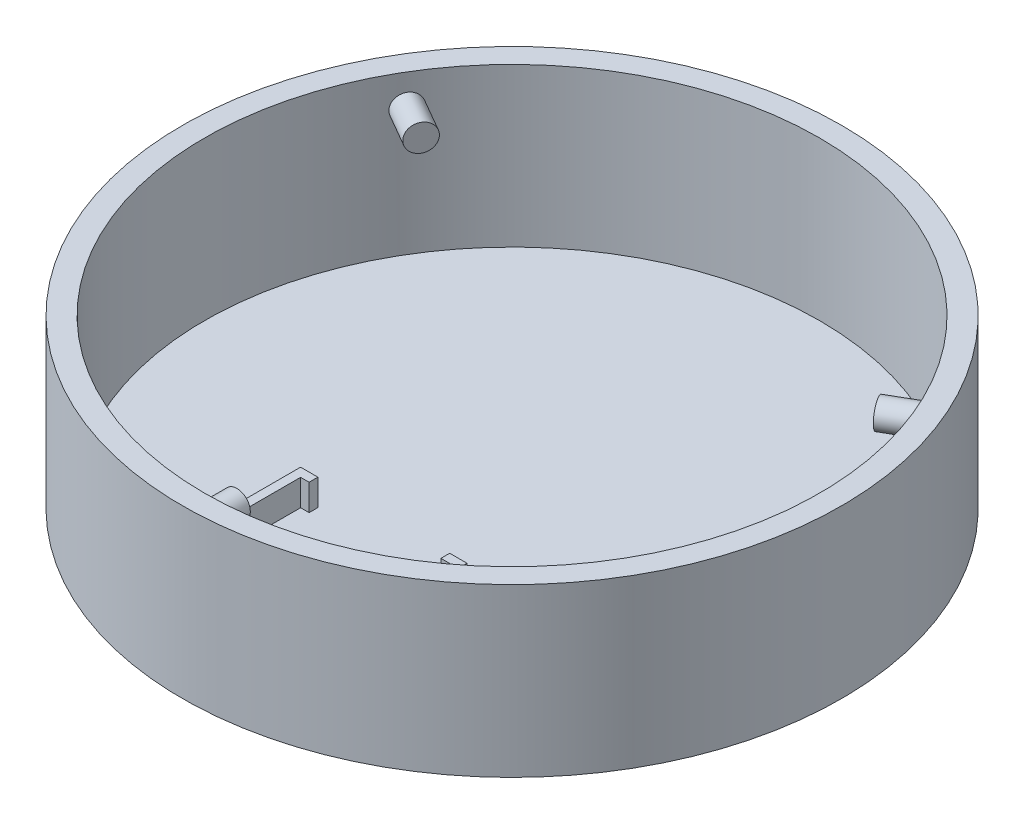
ISO-10303-21;
HEADER;
FILE_DESCRIPTION(('STEP AP214'),'2;1');
FILE_NAME('part.step','',(''),(''),'','','');
FILE_SCHEMA(('AUTOMOTIVE_DESIGN { 1 0 10303 214 1 1 1 1 }'));
ENDSEC;
DATA;
#1=APPLICATION_CONTEXT('core data for automotive mechanical design processes');
#2=APPLICATION_PROTOCOL_DEFINITION('international standard','automotive_design',2000,#1);
#3=PRODUCT_CONTEXT('',#1,'mechanical');
#4=PRODUCT('Part','Part','',(#3));
#5=PRODUCT_RELATED_PRODUCT_CATEGORY('part','',(#4));
#6=PRODUCT_DEFINITION_FORMATION('','',#4);
#7=PRODUCT_DEFINITION_CONTEXT('part definition',#1,'design');
#8=PRODUCT_DEFINITION('design','',#6,#7);
#9=PRODUCT_DEFINITION_SHAPE('','',#8);
#10=(LENGTH_UNIT() NAMED_UNIT(*) SI_UNIT(.MILLI.,.METRE.));
#11=(NAMED_UNIT(*) PLANE_ANGLE_UNIT() SI_UNIT($,.RADIAN.));
#12=(NAMED_UNIT(*) SI_UNIT($,.STERADIAN.) SOLID_ANGLE_UNIT());
#13=UNCERTAINTY_MEASURE_WITH_UNIT(LENGTH_MEASURE(1.E-05),#10,'distance_accuracy_value','');
#14=(GEOMETRIC_REPRESENTATION_CONTEXT(3) GLOBAL_UNCERTAINTY_ASSIGNED_CONTEXT((#13)) GLOBAL_UNIT_ASSIGNED_CONTEXT((#10,
#11,#12)) REPRESENTATION_CONTEXT('',''));
#15=CARTESIAN_POINT('',(0.,0.,0.));
#16=DIRECTION('',(0.,0.,1.));
#17=DIRECTION('',(1.,0.,0.));
#18=AXIS2_PLACEMENT_3D('',#15,#16,#17);
#19=CARTESIAN_POINT('',(17.3810889466934,10.16,30.4071253878576));
#20=DIRECTION('',(0.,0.,1.));
#21=DIRECTION('',(1.,0.,0.));
#22=AXIS2_PLACEMENT_3D('',#19,#20,#21);
#23=PLANE('',#22);
#24=DIRECTION('',(-1.,0.,0.));
#25=VECTOR('',#24,1.);
#26=CARTESIAN_POINT('',(17.3810889466934,10.16,30.4071253878576));
#27=LINE('',#26,#25);
#28=CARTESIAN_POINT('',(-25.7149110533066,10.16,30.4071253878576));
#29=VERTEX_POINT('',#28);
#30=CARTESIAN_POINT('',(-30.7149110533066,10.16,30.4071253878576));
#31=VERTEX_POINT('',#30);
#32=EDGE_CURVE('E197',#29,#31,#27,.T.);
#33=ORIENTED_EDGE('',*,*,#32,.F.);
#34=DIRECTION('',(0.,1.,0.));
#35=VECTOR('',#34,1.);
#36=CARTESIAN_POINT('',(-25.7149110533066,10.16,30.4071253878576));
#37=LINE('',#36,#35);
#38=CARTESIAN_POINT('',(-25.7149110533066,2.54,30.4071253878576));
#39=VERTEX_POINT('',#38);
#40=EDGE_CURVE('E189',#39,#29,#37,.T.);
#41=ORIENTED_EDGE('',*,*,#40,.F.);
#42=DIRECTION('',(-1.,0.,0.));
#43=VECTOR('',#42,1.);
#44=CARTESIAN_POINT('',(17.3810889466934,2.54,30.4071253878576));
#45=LINE('',#44,#43);
#46=CARTESIAN_POINT('',(-30.7149110533066,2.54,30.4071253878576));
#47=VERTEX_POINT('',#46);
#48=EDGE_CURVE('E216',#39,#47,#45,.T.);
#49=ORIENTED_EDGE('',*,*,#48,.T.);
#50=DIRECTION('',(0.,-1.,0.));
#51=VECTOR('',#50,1.);
#52=CARTESIAN_POINT('',(-30.7149110533066,10.16,30.4071253878576));
#53=LINE('',#52,#51);
#54=EDGE_CURVE('E232',#31,#47,#53,.T.);
#55=ORIENTED_EDGE('',*,*,#54,.F.);
#56=EDGE_LOOP('',(#33,#41,#49,#55));
#57=FACE_BOUND('',#56,.T.);
#58=ADVANCED_FACE('F69',(#57),#23,.F.);
#59=CARTESIAN_POINT('',(14.8410889466934,10.16,32.9471253878576));
#60=DIRECTION('',(0.,0.,1.));
#61=DIRECTION('',(1.,0.,0.));
#62=AXIS2_PLACEMENT_3D('',#59,#60,#61);
#63=PLANE('',#62);
#64=DIRECTION('',(0.,1.,0.));
#65=VECTOR('',#64,1.);
#66=CARTESIAN_POINT('',(-25.7149110533066,10.16,32.9471253878576));
#67=LINE('',#66,#65);
#68=CARTESIAN_POINT('',(-25.7149110533066,2.54,32.9471253878576));
#69=VERTEX_POINT('',#68);
#70=CARTESIAN_POINT('',(-25.7149110533066,10.16,32.9471253878576));
#71=VERTEX_POINT('',#70);
#72=EDGE_CURVE('E402',#69,#71,#67,.T.);
#73=ORIENTED_EDGE('',*,*,#72,.T.);
#74=DIRECTION('',(-1.,0.,0.));
#75=VECTOR('',#74,1.);
#76=CARTESIAN_POINT('',(14.8410889466934,10.16,32.9471253878576));
#77=LINE('',#76,#75);
#78=CARTESIAN_POINT('',(-28.1749110533066,10.16,32.9471253878576));
#79=VERTEX_POINT('',#78);
#80=EDGE_CURVE('E356',#71,#79,#77,.T.);
#81=ORIENTED_EDGE('',*,*,#80,.T.);
#82=DIRECTION('',(0.,-1.,0.));
#83=VECTOR('',#82,1.);
#84=CARTESIAN_POINT('',(-28.1749110533066,10.16,32.9471253878576));
#85=LINE('',#84,#83);
#86=CARTESIAN_POINT('',(-28.1749110533066,2.54,32.9471253878576));
#87=VERTEX_POINT('',#86);
#88=EDGE_CURVE('E205',#79,#87,#85,.T.);
#89=ORIENTED_EDGE('',*,*,#88,.T.);
#90=DIRECTION('',(-1.,0.,0.));
#91=VECTOR('',#90,1.);
#92=CARTESIAN_POINT('',(14.8410889466934,2.54,32.9471253878576));
#93=LINE('',#92,#91);
#94=EDGE_CURVE('E343',#69,#87,#93,.T.);
#95=ORIENTED_EDGE('',*,*,#94,.F.);
#96=EDGE_LOOP('',(#73,#81,#89,#95));
#97=FACE_BOUND('',#96,.T.);
#98=ADVANCED_FACE('F298',(#97),#63,.T.);
#99=CARTESIAN_POINT('',(0.,48.26,0.));
#100=DIRECTION('',(0.,-1.,0.));
#101=DIRECTION('',(0.,0.,-1.));
#102=AXIS2_PLACEMENT_3D('',#99,#100,#101);
#103=CYLINDRICAL_SURFACE('',#102,95.25);
#104=CARTESIAN_POINT('',(0.,48.26,0.));
#105=DIRECTION('',(0.,1.,0.));
#106=DIRECTION('',(0.,0.,1.));
#107=AXIS2_PLACEMENT_3D('',#104,#105,#106);
#108=CIRCLE('',#107,95.25);
#109=CARTESIAN_POINT('',(0.,48.26,-95.25));
#110=VERTEX_POINT('',#109);
#111=EDGE_CURVE('E12',#110,#110,#108,.T.);
#112=CARTESIAN_POINT('',(0.,0.,0.));
#113=DIRECTION('',(0.,1.,0.));
#114=DIRECTION('',(0.,0.,1.));
#115=AXIS2_PLACEMENT_3D('',#112,#113,#114);
#116=CIRCLE('',#115,95.25);
#117=CARTESIAN_POINT('',(0.,0.,-95.25));
#118=VERTEX_POINT('',#117);
#119=EDGE_CURVE('E84',#118,#118,#116,.T.);
#120=CARTESIAN_POINT('',(0.,48.26,-95.25));
#121=CARTESIAN_POINT('',(0.,47.7572916666667,-95.25));
#122=CARTESIAN_POINT('',(0.,47.2545833333333,-95.25));
#123=CARTESIAN_POINT('',(0.,46.2491666666667,-95.25));
#124=CARTESIAN_POINT('',(0.,45.7464583333333,-95.25));
#125=CARTESIAN_POINT('',(0.,44.7410416666667,-95.25));
#126=CARTESIAN_POINT('',(0.,44.2383333333333,-95.25));
#127=CARTESIAN_POINT('',(0.,43.2329166666667,-95.25));
#128=CARTESIAN_POINT('',(0.,42.7302083333333,-95.25));
#129=CARTESIAN_POINT('',(0.,41.7247916666667,-95.25));
#130=CARTESIAN_POINT('',(0.,41.2220833333333,-95.25));
#131=CARTESIAN_POINT('',(0.,40.2166666666667,-95.25));
#132=CARTESIAN_POINT('',(0.,39.7139583333333,-95.25));
#133=CARTESIAN_POINT('',(0.,38.7085416666667,-95.25));
#134=CARTESIAN_POINT('',(0.,38.2058333333333,-95.25));
#135=CARTESIAN_POINT('',(0.,37.2004166666667,-95.25));
#136=CARTESIAN_POINT('',(0.,36.6977083333333,-95.25));
#137=CARTESIAN_POINT('',(0.,35.6922916666667,-95.25));
#138=CARTESIAN_POINT('',(0.,35.1895833333333,-95.25));
#139=CARTESIAN_POINT('',(0.,34.1841666666667,-95.25));
#140=CARTESIAN_POINT('',(0.,33.6814583333333,-95.25));
#141=CARTESIAN_POINT('',(0.,32.6760416666667,-95.25));
#142=CARTESIAN_POINT('',(0.,32.1733333333333,-95.25));
#143=CARTESIAN_POINT('',(0.,31.1679166666667,-95.25));
#144=CARTESIAN_POINT('',(0.,30.6652083333333,-95.25));
#145=CARTESIAN_POINT('',(0.,29.6597916666667,-95.25));
#146=CARTESIAN_POINT('',(0.,29.1570833333333,-95.25));
#147=CARTESIAN_POINT('',(0.,28.1516666666667,-95.25));
#148=CARTESIAN_POINT('',(0.,27.6489583333333,-95.25));
#149=CARTESIAN_POINT('',(0.,26.6435416666667,-95.25));
#150=CARTESIAN_POINT('',(0.,26.1408333333333,-95.25));
#151=CARTESIAN_POINT('',(0.,25.1354166666667,-95.25));
#152=CARTESIAN_POINT('',(0.,24.6327083333333,-95.25));
#153=CARTESIAN_POINT('',(0.,23.6272916666667,-95.25));
#154=CARTESIAN_POINT('',(0.,23.1245833333333,-95.25));
#155=CARTESIAN_POINT('',(0.,22.1191666666667,-95.25));
#156=CARTESIAN_POINT('',(0.,21.6164583333333,-95.25));
#157=CARTESIAN_POINT('',(0.,20.6110416666667,-95.25));
#158=CARTESIAN_POINT('',(0.,20.1083333333333,-95.25));
#159=CARTESIAN_POINT('',(0.,19.1029166666667,-95.25));
#160=CARTESIAN_POINT('',(0.,18.6002083333333,-95.25));
#161=CARTESIAN_POINT('',(0.,17.5947916666667,-95.25));
#162=CARTESIAN_POINT('',(0.,17.0920833333333,-95.25));
#163=CARTESIAN_POINT('',(0.,16.0866666666667,-95.25));
#164=CARTESIAN_POINT('',(0.,15.5839583333333,-95.25));
#165=CARTESIAN_POINT('',(0.,14.5785416666667,-95.25));
#166=CARTESIAN_POINT('',(0.,14.0758333333333,-95.25));
#167=CARTESIAN_POINT('',(0.,13.0704166666667,-95.25));
#168=CARTESIAN_POINT('',(0.,12.5677083333333,-95.25));
#169=CARTESIAN_POINT('',(0.,11.5622916666667,-95.25));
#170=CARTESIAN_POINT('',(0.,11.0595833333333,-95.25));
#171=CARTESIAN_POINT('',(0.,10.0541666666667,-95.25));
#172=CARTESIAN_POINT('',(0.,9.55145833333333,-95.25));
#173=CARTESIAN_POINT('',(0.,8.54604166666666,-95.25));
#174=CARTESIAN_POINT('',(0.,8.04333333333333,-95.25));
#175=CARTESIAN_POINT('',(0.,7.03791666666666,-95.25));
#176=CARTESIAN_POINT('',(0.,6.53520833333333,-95.25));
#177=CARTESIAN_POINT('',(0.,5.52979166666666,-95.25));
#178=CARTESIAN_POINT('',(0.,5.02708333333333,-95.25));
#179=CARTESIAN_POINT('',(0.,4.02166666666666,-95.25));
#180=CARTESIAN_POINT('',(0.,3.51895833333333,-95.25));
#181=CARTESIAN_POINT('',(0.,2.51354166666666,-95.25));
#182=CARTESIAN_POINT('',(0.,2.01083333333333,-95.25));
#183=CARTESIAN_POINT('',(0.,1.00541666666666,-95.25));
#184=CARTESIAN_POINT('',(0.,0.502708333333326,-95.25));
#185=CARTESIAN_POINT('',(0.,0.,-95.25));
#186=B_SPLINE_CURVE_WITH_KNOTS('',3,(#120,#121,#122,#123,#124,#125,#126,#127,#128,#129,#130,
#131,#132,#133,#134,#135,#136,#137,#138,#139,#140,#141,#142,#143,#144,#145,#146,#147,#148,#149,
#150,#151,#152,#153,#154,#155,#156,#157,#158,#159,#160,#161,#162,#163,#164,#165,#166,#167,#168,
#169,#170,#171,#172,#173,#174,#175,#176,#177,#178,#179,#180,#181,#182,#183,#184,#185),
.UNSPECIFIED.,.F.,.F.,(4,2,2,2,2,2,2,2,2,2,2,2,2,2,2,2,2,2,2,2,2,2,2,2,2,2,2,2,2,2,2,2,4),(0.,
1.50812500000001,3.01625000000001,4.524375,6.0325,7.540625,9.04875,10.556875,12.065,13.573125,
15.08125,16.589375,18.0975,19.605625,21.11375,22.621875,24.13,25.638125,27.14625,28.654375,
30.1625,31.670625,33.17875,34.686875,36.195,37.703125,39.21125,40.719375,42.2275,43.735625,
45.24375,46.751875,48.26),.UNSPECIFIED.);
#187=EDGE_CURVE('BSEAM71',#110,#118,#186,.T.);
#188=ORIENTED_EDGE('',*,*,#111,.F.);
#189=ORIENTED_EDGE('',*,*,#119,.T.);
#190=ORIENTED_EDGE('',*,*,#187,.T.);
#191=ORIENTED_EDGE('',*,*,#187,.F.);
#192=EDGE_LOOP('',(#188,#190,#189,#191));
#193=FACE_BOUND('',#192,.T.);
#194=ADVANCED_FACE('F71',(#193),#103,.T.);
#195=CARTESIAN_POINT('',(0.,48.26,0.));
#196=DIRECTION('',(0.,1.,0.));
#197=DIRECTION('',(0.,0.,1.));
#198=AXIS2_PLACEMENT_3D('',#195,#196,#197);
#199=PLANE('',#198);
#200=CARTESIAN_POINT('',(0.,48.26,0.));
#201=DIRECTION('',(0.,1.,0.));
#202=DIRECTION('',(0.,0.,1.));
#203=AXIS2_PLACEMENT_3D('',#200,#201,#202);
#204=CIRCLE('',#203,88.9);
#205=CARTESIAN_POINT('',(0.,48.26,88.9));
#206=VERTEX_POINT('',#205);
#207=EDGE_CURVE('E254',#206,#206,#204,.T.);
#208=ORIENTED_EDGE('',*,*,#207,.F.);
#209=EDGE_LOOP('',(#208));
#210=FACE_BOUND('',#209,.T.);
#211=ORIENTED_EDGE('',*,*,#111,.T.);
#212=EDGE_LOOP('',(#211));
#213=FACE_BOUND('',#212,.T.);
#214=ADVANCED_FACE('F545',(#210,#213),#199,.T.);
#215=CARTESIAN_POINT('',(0.,0.,0.));
#216=DIRECTION('',(0.,1.,0.));
#217=DIRECTION('',(0.,0.,1.));
#218=AXIS2_PLACEMENT_3D('',#215,#216,#217);
#219=PLANE('',#218);
#220=ORIENTED_EDGE('',*,*,#119,.F.);
#221=EDGE_LOOP('',(#220));
#222=FACE_BOUND('',#221,.T.);
#223=ADVANCED_FACE('F549',(#222),#219,.F.);
#224=CARTESIAN_POINT('',(0.,2.54,0.));
#225=DIRECTION('',(0.,1.,0.));
#226=DIRECTION('',(0.,0.,1.));
#227=AXIS2_PLACEMENT_3D('',#224,#225,#226);
#228=CYLINDRICAL_SURFACE('',#227,88.9);
#229=CARTESIAN_POINT('',(79.5929794989805,39.26,-39.6000961422428));
#230=CARTESIAN_POINT('',(79.5929758198982,39.0425887767114,-39.6001051451292));
#231=CARTESIAN_POINT('',(79.5847910182511,38.8250224354021,-39.6165675609572));
#232=CARTESIAN_POINT('',(79.5521996257889,38.3958929375781,-39.6819709444511));
#233=CARTESIAN_POINT('',(79.5277738156264,38.1843372035765,-39.7309503921424));
#234=CARTESIAN_POINT('',(79.46323308593,37.7735112511927,-39.8598764942506));
#235=CARTESIAN_POINT('',(79.4231264635019,37.5742346000885,-39.9398067716032));
#236=CARTESIAN_POINT('',(79.3281156362433,37.1935526996715,-40.1281839101891));
#237=CARTESIAN_POINT('',(79.273214920508,37.0121432502473,-40.2366240474016));
#238=CARTESIAN_POINT('',(79.1497678759937,36.6720357950268,-40.4789167223367));
#239=CARTESIAN_POINT('',(79.081204782356,36.5133661081465,-40.6128004720219));
#240=CARTESIAN_POINT('',(78.9320619837048,36.2234775197614,-40.9019069491397));
#241=CARTESIAN_POINT('',(78.851481735383,36.0922598600368,-41.0571306413489));
#242=CARTESIAN_POINT('',(78.6801397210465,35.8608485038301,-41.3845350455569));
#243=CARTESIAN_POINT('',(78.5893656144512,35.7606929745236,-41.5567362789451));
#244=CARTESIAN_POINT('',(78.4000000623118,35.5944738083307,-41.9128933142008));
#245=CARTESIAN_POINT('',(78.3014086474818,35.5284100375057,-42.0968490698844));
#246=CARTESIAN_POINT('',(78.0990414359978,35.4322845430014,-42.471107117498));
#247=CARTESIAN_POINT('',(77.9952676586307,35.4022089089622,-42.6614069280306));
#248=CARTESIAN_POINT('',(77.7853545021627,35.3788865025105,-43.0429556166875));
#249=CARTESIAN_POINT('',(77.6792151444547,35.3856393971766,-43.2342044862169));
#250=CARTESIAN_POINT('',(77.4677393426387,35.4357652431191,-43.611995853298));
#251=CARTESIAN_POINT('',(77.3624021002805,35.4790950660853,-43.7985436272992));
#252=CARTESIAN_POINT('',(77.1555350256693,35.6010939302572,-44.1619424238062));
#253=CARTESIAN_POINT('',(77.0540051890898,35.6797629313063,-44.3387934573304));
#254=CARTESIAN_POINT('',(76.857913378918,35.8701680785282,-44.6778416323216));
#255=CARTESIAN_POINT('',(76.7633486234969,35.9818909326813,-44.8400446300787));
#256=CARTESIAN_POINT('',(76.5841313797801,36.2352453443452,-45.1454562946207));
#257=CARTESIAN_POINT('',(76.4994789204995,36.3768769894008,-45.288664905806));
#258=CARTESIAN_POINT('',(76.3427896110524,36.6861148680796,-45.5523002486622));
#259=CARTESIAN_POINT('',(76.2707593658409,36.8537346148128,-45.6727150554144));
#260=CARTESIAN_POINT('',(76.1417560986276,37.2101426369181,-45.887457125731));
#261=CARTESIAN_POINT('',(76.0847831076065,37.398930955844,-45.9817843356195));
#262=CARTESIAN_POINT('',(75.9877979970046,37.792398760094,-46.1418829612074));
#263=CARTESIAN_POINT('',(75.9477922607391,37.997084191929,-46.2076436300051));
#264=CARTESIAN_POINT('',(75.8861416457657,38.4164742385188,-46.3088225505772));
#265=CARTESIAN_POINT('',(75.8644967331612,38.6311788347761,-46.3442408583677));
#266=CARTESIAN_POINT('',(75.8403173317584,39.0644620622004,-46.3837990730513));
#267=CARTESIAN_POINT('',(75.8377786480412,39.2830398324181,-46.3879458458499));
#268=CARTESIAN_POINT('',(75.8518885262761,39.7179080606757,-46.3648701362989));
#269=CARTESIAN_POINT('',(75.868537075118,39.9341985202785,-46.3376476753833));
#270=CARTESIAN_POINT('',(75.9204419116952,40.3583164410198,-46.2525562241077));
#271=CARTESIAN_POINT('',(75.9556951598263,40.5661452786311,-46.1946922399027));
#272=CARTESIAN_POINT('',(76.0435989996554,40.9674829435946,-46.0498445906337));
#273=CARTESIAN_POINT('',(76.0962496312858,41.1609917380766,-45.9628608587306));
#274=CARTESIAN_POINT('',(76.2171813674947,41.5282521698166,-45.7620470853653));
#275=CARTESIAN_POINT('',(76.2854666270952,41.7019985366532,-45.6482099071503));
#276=CARTESIAN_POINT('',(76.4353840178553,42.0247466089832,-45.3967338202294));
#277=CARTESIAN_POINT('',(76.5170161625555,42.1737482893726,-45.2590948873763));
#278=CARTESIAN_POINT('',(76.690967770721,42.4427875712459,-44.9637052193187));
#279=CARTESIAN_POINT('',(76.7832880340355,42.5628230029541,-44.8059529788379));
#280=CARTESIAN_POINT('',(76.9756662801889,42.770503304993,-44.474638239037));
#281=CARTESIAN_POINT('',(77.0757242220307,42.8581483469256,-44.3010758234841));
#282=CARTESIAN_POINT('',(77.2804204422942,42.9985199151308,-43.9430208879394));
#283=CARTESIAN_POINT('',(77.3850562616718,43.0512649485615,-43.7585342176238));
#284=CARTESIAN_POINT('',(77.5958190885301,43.1204179185624,-43.3836959333607));
#285=CARTESIAN_POINT('',(77.7019460941333,43.1368259008796,-43.1933443267973));
#286=CARTESIAN_POINT('',(77.912587727743,43.1328519423419,-42.8122186526074));
#287=CARTESIAN_POINT('',(78.0171028862169,43.1124823775151,-42.6214447486641));
#288=CARTESIAN_POINT('',(78.2216606445408,43.0355722498535,-42.2448546309024));
#289=CARTESIAN_POINT('',(78.3217032147328,42.9790314472044,-42.0590384499622));
#290=CARTESIAN_POINT('',(78.5147350346616,42.8313397220287,-41.6975830036456));
#291=CARTESIAN_POINT('',(78.6077188785595,42.7401625882162,-41.5219515619523));
#292=CARTESIAN_POINT('',(78.7841851519857,42.5257958442334,-41.1861408212087));
#293=CARTESIAN_POINT('',(78.867667866949,42.4026071961253,-41.0259610579776));
#294=CARTESIAN_POINT('',(79.0231851195763,42.127559408817,-40.7256049412756));
#295=CARTESIAN_POINT('',(79.0952078457103,41.9756710376178,-40.5854492411089));
#296=CARTESIAN_POINT('',(79.2260293384409,41.6475528068791,-40.3294805093061));
#297=CARTESIAN_POINT('',(79.2848248653854,41.4713170011032,-40.2136734416761));
#298=CARTESIAN_POINT('',(79.3878508100348,41.0994799624709,-40.0099016097811));
#299=CARTESIAN_POINT('',(79.4320758972624,40.9038716763119,-39.9219470355809));
#300=CARTESIAN_POINT('',(79.5049110579353,40.49903671584,-39.776698987093));
#301=CARTESIAN_POINT('',(79.5335397640023,40.2898266273816,-39.7193689280347));
#302=CARTESIAN_POINT('',(79.5670147027677,39.9427504694273,-39.6522502495368));
#303=CARTESIAN_POINT('',(79.5767416269906,39.8071423489891,-39.6327189033487));
#304=CARTESIAN_POINT('',(79.5897251819083,39.5343767481783,-39.6066390170729));
#305=CARTESIAN_POINT('',(79.5929818210363,39.3972192698253,-39.6000904600638));
#306=CARTESIAN_POINT('',(79.5929794989805,39.26,-39.6000961422428));
#307=B_SPLINE_CURVE_WITH_KNOTS('',3,(#229,#230,#231,#232,#233,#234,#235,#236,#237,#238,#239,
#240,#241,#242,#243,#244,#245,#246,#247,#248,#249,#250,#251,#252,#253,#254,#255,#256,#257,#258,
#259,#260,#261,#262,#263,#264,#265,#266,#267,#268,#269,#270,#271,#272,#273,#274,#275,#276,#277,
#278,#279,#280,#281,#282,#283,#284,#285,#286,#287,#288,#289,#290,#291,#292,#293,#294,#295,#296,
#297,#298,#299,#300,#301,#302,#303,#304,#305,#306),.UNSPECIFIED.,.T.,.F.,(4,2,2,2,2,2,2,2,2,2,2,
2,2,2,2,2,2,2,2,2,2,2,2,2,2,2,2,2,2,2,2,2,2,2,2,2,2,2,4),(0.,0.651732462151279,1.3042375498933,
1.95639784728063,2.6084044711058,3.26121614272859,3.91405733760922,4.56769755298959,
5.22133520034976,5.87472011790127,6.52809912901489,7.18070880719647,7.83331774380704,
8.48566460121314,9.13801336810159,9.79070248340624,10.4433929416268,11.0963287336524,
11.7492633202663,12.4020545459053,13.0548453255068,13.7075294862572,14.3602151451318,
15.0130744619621,15.6659344411296,16.3188433089288,16.9717487176137,17.6243076184056,
18.2768656976507,18.9292042252239,19.5815470778269,20.2343845820627,20.8872024684295,
21.5406888997782,22.1943352114919,22.8482203895558,23.5013226640023,23.9126646719579,
24.3240061437785),.UNSPECIFIED.);
#308=CARTESIAN_POINT('',(79.5929794989805,39.26,-39.6000961422428));
#309=VERTEX_POINT('',#308);
#310=EDGE_CURVE('E73',#309,#309,#307,.T.);
#311=ORIENTED_EDGE('',*,*,#310,.T.);
#312=EDGE_LOOP('',(#311));
#313=FACE_BOUND('',#312,.T.);
#314=CARTESIAN_POINT('',(-74.0911790009789,39.26,-49.1294941378894));
#315=CARTESIAN_POINT('',(-74.091184958166,39.0425887767114,-49.1294864502674));
#316=CARTESIAN_POINT('',(-74.1013494276572,38.8250224354021,-49.1141669962022));
#317=CARTESIAN_POINT('',(-74.1416947230254,38.3958929375781,-49.0532403306382));
#318=CARTESIAN_POINT('',(-74.1718992639081,38.1843372035765,-49.0075972346838));
#319=CARTESIAN_POINT('',(-74.2512821786965,37.7735112511927,-48.8872402721338));
#320=CARTESIAN_POINT('',(-74.3004505182013,37.5742346000885,-48.8125417795748));
#321=CARTESIAN_POINT('',(-74.4160844920796,37.1935526996715,-48.6360714202413));
#322=CARTESIAN_POINT('',(-74.4825460478279,37.0121432502473,-48.5343059371224));
#323=CARTESIAN_POINT('',(-74.6306541372154,36.6720357950269,-48.3062513230833));
#324=CARTESIAN_POINT('',(-74.7123193187778,36.5133661081465,-48.1799320673885));
#325=CARTESIAN_POINT('',(-74.8881214730349,36.2234775197614,-47.9062173764061));
#326=CARTESIAN_POINT('',(-74.9822590095964,36.0922598600368,-47.7588209882115));
#327=CARTESIAN_POINT('',(-75.1801285337832,35.8608485038301,-47.4467322489565));
#328=CARTESIAN_POINT('',(-75.2838721231627,35.7606929745236,-47.2820189499451));
#329=CARTESIAN_POINT('',(-75.497630387361,35.5944738083307,-46.9399450535628));
#330=CARTESIAN_POINT('',(-75.6076450375403,35.5284100375057,-46.7625845058832));
#331=CARTESIAN_POINT('',(-75.8305784086024,35.4322845430014,-46.4002003360382));
#332=CARTESIAN_POINT('',(-75.9434959901755,35.4022089089622,-46.2151797033254));
#333=CARTESIAN_POINT('',(-76.168970269099,35.3788865025105,-45.842615232907));
#334=CARTESIAN_POINT('',(-76.2815269697025,35.3856393971766,-45.6550714180258));
#335=CARTESIAN_POINT('',(-76.5029659900172,35.4357652431191,-45.283032317827));
#336=CARTESIAN_POINT('',(-76.6118524801426,35.4790950660853,-45.0985337029796));
#337=CARTESIAN_POINT('',(-76.8231315323167,35.6010939302572,-44.7376821629061));
#338=CARTESIAN_POINT('',(-76.9255241017445,35.6797629313063,-44.5613292284242));
#339=CARTESIAN_POINT('',(-77.1211025293077,35.8701680785282,-44.2219846518457));
#340=CARTESIAN_POINT('',(-77.2142920682248,35.9818909326813,-44.0589876724698));
#341=CARTESIAN_POINT('',(-77.3891777064719,36.2352453443452,-43.7510751543439));
#342=CARTESIAN_POINT('',(-77.4708737721588,36.3768769894008,-43.6061596685214));
#343=CARTESIAN_POINT('',(-77.6208440216841,36.6861148680796,-43.3386450746107));
#344=CARTESIAN_POINT('',(-77.6891111807175,36.8537346148128,-43.2160576490406));
#345=CARTESIAN_POINT('',(-77.8105816352663,37.2101426369181,-42.9969665073044));
#346=CARTESIAN_POINT('',(-77.8637848997873,37.398930955844,-42.9004628448063));
#347=CARTESIAN_POINT('',(-77.9539418213564,37.792398760094,-42.7364219624423));
#348=CARTESIAN_POINT('',(-77.9908893629724,37.997084191929,-42.6688956441404));
#349=CARTESIAN_POINT('',(-78.0476875710285,38.4164742385188,-42.5649151851284));
#350=CARTESIAN_POINT('',(-78.0675382690319,38.6311788347761,-42.528460987055));
#351=CARTESIAN_POINT('',(-78.0897069871749,39.0644620622004,-42.4877419038501));
#352=CARTESIAN_POINT('',(-78.0920288559036,39.2830398324181,-42.4834699528595));
#353=CARTESIAN_POINT('',(-78.0790996443396,39.7179080606757,-42.5072273206306));
#354=CARTESIAN_POINT('',(-78.063848576054,39.9341985202785,-42.5352566173217));
#355=CARTESIAN_POINT('',(-78.0161096358931,40.3583164410198,-42.6227532500147));
#356=CARTESIAN_POINT('',(-77.983624579673,40.5661452786311,-42.6822154505646));
#357=CARTESIAN_POINT('',(-77.9021347556421,40.9674829435946,-42.8307662335813));
#358=CARTESIAN_POINT('',(-77.8531299499133,41.1609917380766,-42.9198548840501));
#359=CARTESIAN_POINT('',(-77.7396859888535,41.5282521698166,-43.1249917264134));
#360=CARTESIAN_POINT('',(-77.6752427304244,41.7019985366532,-43.2410470850389));
#361=CARTESIAN_POINT('',(-77.5324167460867,42.0247466089832,-43.4966173973667));
#362=CARTESIAN_POINT('',(-77.4540340060362,42.1737482893726,-43.6361323748691));
#363=CARTESIAN_POINT('',(-77.2851948535656,42.4427875712459,-43.9344737205984));
#364=CARTESIAN_POINT('',(-77.1947375374626,42.5628230029541,-44.0933015341532));
#365=CARTESIAN_POINT('',(-77.0039996792235,42.770503304993,-44.425563352358));
#366=CARTESIAN_POINT('',(-76.9037191891334,42.8581483469257,-44.5989972796198));
#367=CARTESIAN_POINT('',(-76.695982629133,42.9985199151308,-44.955296874199));
#368=CARTESIAN_POINT('',(-76.5885303956689,43.0512649485615,-45.1381574870836));
#369=CARTESIAN_POINT('',(-76.3692923326153,43.1204179185624,-45.5081025914479));
#370=CARTESIAN_POINT('',(-76.2575065084818,43.1368259008796,-45.6951870776095));
#371=CARTESIAN_POINT('',(-76.0327628094037,43.1328519423419,-46.0681709205051));
#372=CARTESIAN_POINT('',(-75.9198053414466,43.1124823775151,-46.2540706547957));
#373=CARTESIAN_POINT('',(-75.6959476118128,43.0355722498535,-46.6195179289262));
#374=CARTESIAN_POINT('',(-75.5850473637803,42.9790314472044,-46.7990654266425));
#375=CARTESIAN_POINT('',(-75.3685336748983,42.8313397220287,-47.1469636095979));
#376=CARTESIAN_POINT('',(-75.2629243066376,42.7401625882162,-47.3153057014016));
#377=CARTESIAN_POINT('',(-75.060336811003,42.5257958442334,-47.6360353474717));
#378=CARTESIAN_POINT('',(-74.9633584243544,42.4026071961254,-47.7884233810224));
#379=CARTESIAN_POINT('',(-74.781001023422,42.127559408817,-48.0732833308754));
#380=CARTESIAN_POINT('',(-74.6956339896595,41.9756710376178,-48.2057346914406));
#381=CARTESIAN_POINT('',(-74.5393693117092,41.6475528068791,-48.4470137934077));
#382=CARTESIAN_POINT('',(-74.468475212676,41.4713170011032,-48.5558357471855));
#383=CARTESIAN_POINT('',(-74.3435166020039,41.0994799624709,-48.7469447484482));
#384=CARTESIAN_POINT('',(-74.2894582499813,40.9038716763119,-48.8292220845721));
#385=CARTESIAN_POINT('',(-74.2000873304771,40.49903671584,-48.9649232082475));
#386=CARTESIAN_POINT('',(-74.1647523959657,40.2898266273816,-49.0183814245081));
#387=CARTESIAN_POINT('',(-74.1233633847008,39.9427504694273,-49.080930911118));
#388=CARTESIAN_POINT('',(-74.1113122048433,39.8071423489891,-49.0991203476898));
#389=CARTESIAN_POINT('',(-74.0952181382595,39.5343767481783,-49.1234043792178));
#390=CARTESIAN_POINT('',(-74.0911752410954,39.3972192698253,-49.1294989899382));
#391=CARTESIAN_POINT('',(-74.0911790009789,39.26,-49.1294941378894));
#392=B_SPLINE_CURVE_WITH_KNOTS('',3,(#314,#315,#316,#317,#318,#319,#320,#321,#322,#323,#324,
#325,#326,#327,#328,#329,#330,#331,#332,#333,#334,#335,#336,#337,#338,#339,#340,#341,#342,#343,
#344,#345,#346,#347,#348,#349,#350,#351,#352,#353,#354,#355,#356,#357,#358,#359,#360,#361,#362,
#363,#364,#365,#366,#367,#368,#369,#370,#371,#372,#373,#374,#375,#376,#377,#378,#379,#380,#381,
#382,#383,#384,#385,#386,#387,#388,#389,#390,#391),.UNSPECIFIED.,.T.,.F.,(4,2,2,2,2,2,2,2,2,2,2,
2,2,2,2,2,2,2,2,2,2,2,2,2,2,2,2,2,2,2,2,2,2,2,2,2,2,2,4),(0.,0.65173246215128,1.30423754989331,
1.95639784728064,2.6084044711058,3.26121614272859,3.91405733760922,4.56769755298959,
5.22133520034975,5.87472011790128,6.52809912901489,7.18070880719647,7.83331774380705,
8.48566460121314,9.13801336810158,9.79070248340624,10.4433929416268,11.0963287336524,
11.7492633202663,12.4020545459053,13.0548453255068,13.7075294862572,14.3602151451318,
15.0130744619621,15.6659344411296,16.3188433089288,16.9717487176137,17.6243076184056,
18.2768656976507,18.9292042252239,19.5815470778269,20.2343845820627,20.8872024684295,
21.5406888997783,22.1943352114919,22.8482203895558,23.5013226640023,23.9126646719579,
24.3240061437785),.UNSPECIFIED.);
#393=CARTESIAN_POINT('',(-74.0911790009789,39.26,-49.1294941378894));
#394=VERTEX_POINT('',#393);
#395=EDGE_CURVE('E244',#394,#394,#392,.T.);
#396=ORIENTED_EDGE('',*,*,#395,.T.);
#397=EDGE_LOOP('',(#396));
#398=FACE_BOUND('',#397,.T.);
#399=CARTESIAN_POINT('',(0.,35.7430204521914,88.9));
#400=CARTESIAN_POINT('',(0.197518261287702,35.8343943157047,88.8999993546398));
#401=CARTESIAN_POINT('',(0.38746283851697,35.9425117734692,88.8993361545189));
#402=CARTESIAN_POINT('',(0.746657430349968,36.1891862385074,88.8970467437268));
#403=CARTESIAN_POINT('',(0.915882533227582,36.3277793388845,88.895419387275));
#404=CARTESIAN_POINT('',(1.22859178769886,36.6313499644598,88.8916477178999));
#405=CARTESIAN_POINT('',(1.37208851024621,36.7963145295497,88.8895036586461));
#406=CARTESIAN_POINT('',(1.62931634257254,37.1479448932025,88.8851614904845));
#407=CARTESIAN_POINT('',(1.7430547188246,37.3346053778894,88.8829633949152));
#408=CARTESIAN_POINT('',(1.9376292940089,37.7244422357821,88.8789351245105));
#409=CARTESIAN_POINT('',(2.01845358563395,37.9276245542474,88.8771050829468));
#410=CARTESIAN_POINT('',(2.14484493198946,38.3446873880156,88.8741451111216));
#411=CARTESIAN_POINT('',(2.19041069254742,38.5585682957058,88.873015206559));
#412=CARTESIAN_POINT('',(2.2449784518139,38.990900600355,88.8716536955828));
#413=CARTESIAN_POINT('',(2.25398834064723,39.209351000814,88.8714218953252));
#414=CARTESIAN_POINT('',(2.23520956503546,39.6446627235601,88.8718961288089));
#415=CARTESIAN_POINT('',(2.20742100287198,39.8615240502624,88.8726021599434));
#416=CARTESIAN_POINT('',(2.11584461335515,40.2874610147499,88.8748292544667));
#417=CARTESIAN_POINT('',(2.05206342300655,40.4965380803703,88.8763501675894));
#418=CARTESIAN_POINT('',(1.89031853442045,40.9010180587796,88.8799369914471));
#419=CARTESIAN_POINT('',(1.79235481831902,41.0964209644223,88.882002902467));
#420=CARTESIAN_POINT('',(1.5649952180821,41.4680600220804,88.8862962982285));
#421=CARTESIAN_POINT('',(1.43559140744768,41.6442913244128,88.888523823616));
#422=CARTESIAN_POINT('',(1.14903391637241,41.9725325334948,88.8926892220131));
#423=CARTESIAN_POINT('',(0.991880182609156,42.1245423937011,88.8946270944661));
#424=CARTESIAN_POINT('',(0.654261628473722,42.4000408911658,88.897752430434));
#425=CARTESIAN_POINT('',(0.473794343217479,42.5235265087723,88.8989398145233));
#426=CARTESIAN_POINT('',(0.0946858982312121,42.7384461264682,88.9001513817855));
#427=CARTESIAN_POINT('',(-0.10395518044069,42.8298802695036,88.9001755701463));
#428=CARTESIAN_POINT('',(-0.513660494481499,42.9780605507299,88.8987517351839));
#429=CARTESIAN_POINT('',(-0.724718377703666,43.0348242592124,88.8973044585627));
#430=CARTESIAN_POINT('',(-1.15334914891378,43.1121284530183,88.8927764300176));
#431=CARTESIAN_POINT('',(-1.37092201572349,43.1326690560791,88.8896956834031));
#432=CARTESIAN_POINT('',(-1.80631749000438,43.1369547366784,88.8819138304065));
#433=CARTESIAN_POINT('',(-2.02413997198982,43.1207137196429,88.8772133369452));
#434=CARTESIAN_POINT('',(-2.45394198496057,43.0519424451329,88.866385090646));
#435=CARTESIAN_POINT('',(-2.66592149092484,42.9994120322836,88.8602573316972));
#436=CARTESIAN_POINT('',(-3.07818171231924,42.8595183242387,88.8469323890827));
#437=CARTESIAN_POINT('',(-3.27845436965477,42.7721313527705,88.8397344806081));
#438=CARTESIAN_POINT('',(-3.66148596974551,42.5650089747664,88.8247730275093));
#439=CARTESIAN_POINT('',(-3.84424476496534,42.4452732957601,88.8170094781213));
#440=CARTESIAN_POINT('',(-4.18728531524675,42.1766848922275,88.8014989176429));
#441=CARTESIAN_POINT('',(-4.34754097806546,42.0277988389954,88.7937519358419));
#442=CARTESIAN_POINT('',(-4.64078409596043,41.7052079468177,88.7789092831694));
#443=CARTESIAN_POINT('',(-4.77377152846194,41.5315030873254,88.7718136128371));
#444=CARTESIAN_POINT('',(-5.00869510854091,41.1641900816913,88.7588692183146));
#445=CARTESIAN_POINT('',(-5.11063153720065,40.9705821157391,88.753020482837));
#446=CARTESIAN_POINT('',(-5.28053932686059,40.5689536728542,88.7430740323283));
#447=CARTESIAN_POINT('',(-5.34851100444869,40.3609333302808,88.7389763009761));
#448=CARTESIAN_POINT('',(-5.44846121076098,39.9367198295976,88.7328958109515));
#449=CARTESIAN_POINT('',(-5.48049387265518,39.7205394716222,88.730909871627));
#450=CARTESIAN_POINT('',(-5.50782847660267,39.285861173429,88.729217402151));
#451=CARTESIAN_POINT('',(-5.50313078309946,39.0673632562279,88.7295108493832));
#452=CARTESIAN_POINT('',(-5.45717048970588,38.634546944906,88.7323492672175));
#453=CARTESIAN_POINT('',(-5.41595465169123,38.4202235638229,88.7348913584));
#454=CARTESIAN_POINT('',(-5.29820422743187,38.0015447824731,88.7419995304807));
#455=CARTESIAN_POINT('',(-5.22166947580551,37.7971894288868,88.7465656208563));
#456=CARTESIAN_POINT('',(-5.03541450615325,37.4041171414325,88.7573279368356));
#457=CARTESIAN_POINT('',(-4.92567603600003,37.2154088816659,88.763525058775));
#458=CARTESIAN_POINT('',(-4.6761465244424,36.8590784404979,88.7770196163981));
#459=CARTESIAN_POINT('',(-4.53635511078239,36.6914565203266,88.7843170657108));
#460=CARTESIAN_POINT('',(-4.23041232731471,36.3817558100721,88.7994203331845));
#461=CARTESIAN_POINT('',(-4.06421651317766,36.2397209644602,88.807226995163));
#462=CARTESIAN_POINT('',(-3.71034400712239,35.9855649848666,88.8227147622857));
#463=CARTESIAN_POINT('',(-3.52266802996081,35.8734428559466,88.8303958715981));
#464=CARTESIAN_POINT('',(-3.13100474771863,35.6822185607183,88.8450628685651));
#465=CARTESIAN_POINT('',(-2.9270065597555,35.6031386477216,88.85204828528));
#466=CARTESIAN_POINT('',(-2.50853361677052,35.4803540127211,88.8648470932201));
#467=CARTESIAN_POINT('',(-2.29405636810919,35.4366577546563,88.8706602037743));
#468=CARTESIAN_POINT('',(-1.86086813301596,35.3859325557038,88.8807859292604));
#469=CARTESIAN_POINT('',(-1.64215861968382,35.3788910790745,88.8850990567076));
#470=CARTESIAN_POINT('',(-1.20682111864975,35.4016785912942,88.8920741537133));
#471=CARTESIAN_POINT('',(-0.990190962646342,35.4314636906369,88.8947380830938));
#472=CARTESIAN_POINT('',(-0.643894834065781,35.509215344212,88.8977696149699));
#473=CARTESIAN_POINT('',(-0.51171001270389,35.5463765051032,88.8986221719337));
#474=CARTESIAN_POINT('',(-0.252013739738629,35.6344810850505,88.8997375675113));
#475=CARTESIAN_POINT('',(-0.124502282852192,35.6854244885258,88.9000004067919));
#476=CARTESIAN_POINT('',(0.,35.7430204521914,88.9));
#477=B_SPLINE_CURVE_WITH_KNOTS('',3,(#399,#400,#401,#402,#403,#404,#405,#406,#407,#408,#409,
#410,#411,#412,#413,#414,#415,#416,#417,#418,#419,#420,#421,#422,#423,#424,#425,#426,#427,#428,
#429,#430,#431,#432,#433,#434,#435,#436,#437,#438,#439,#440,#441,#442,#443,#444,#445,#446,#447,
#448,#449,#450,#451,#452,#453,#454,#455,#456,#457,#458,#459,#460,#461,#462,#463,#464,#465,#466,
#467,#468,#469,#470,#471,#472,#473,#474,#475,#476),.UNSPECIFIED.,.T.,.F.,(4,2,2,2,2,2,2,2,2,2,2,
2,2,2,2,2,2,2,2,2,2,2,2,2,2,2,2,2,2,2,2,2,2,2,2,2,2,2,4),(0.,0.652388054494845,1.30555295104813,
1.95839783463809,2.61108315571493,3.26400438902483,3.91694958682219,4.56975384711735,
5.22255629294102,5.87523840196089,6.52792085207553,7.18076802386189,7.83361645012947,
8.48653395702201,9.13944855193654,9.79203198748866,10.4446133019203,11.0969479467858,
11.7492853846718,12.4020666785466,13.054853470916,13.708391023638,14.3619291174066,
15.0154612949918,15.6689873808429,16.3215277654053,16.9740616753829,17.6257612143545,
18.2774638049558,18.9295252901762,19.5815948527258,20.2347738505314,20.8879311199931,
21.5415275723229,22.1952803218958,22.8488094767861,23.5015605130598,23.912782712891,
24.3240044478363),.UNSPECIFIED.);
#478=CARTESIAN_POINT('',(0.,35.7430204521914,88.9));
#479=VERTEX_POINT('',#478);
#480=EDGE_CURVE('E249',#479,#479,#477,.T.);
#481=ORIENTED_EDGE('',*,*,#480,.T.);
#482=EDGE_LOOP('',(#481));
#483=FACE_BOUND('',#482,.T.);
#484=CARTESIAN_POINT('',(0.,2.54,0.));
#485=DIRECTION('',(0.,1.,0.));
#486=DIRECTION('',(0.,0.,1.));
#487=AXIS2_PLACEMENT_3D('',#484,#485,#486);
#488=CIRCLE('',#487,88.9);
#489=CARTESIAN_POINT('',(0.,2.54,88.9));
#490=VERTEX_POINT('',#489);
#491=EDGE_CURVE('E250',#490,#490,#488,.T.);
#492=ORIENTED_EDGE('',*,*,#491,.F.);
#493=EDGE_LOOP('',(#492));
#494=FACE_BOUND('',#493,.T.);
#495=ORIENTED_EDGE('',*,*,#207,.T.);
#496=EDGE_LOOP('',(#495));
#497=FACE_BOUND('',#496,.T.);
#498=ADVANCED_FACE('F271',(#313,#398,#483,#494,#497),#228,.F.);
#499=CARTESIAN_POINT('',(-1.62680049800101,39.26,95.252));
#500=DIRECTION('',(0.,0.,-1.));
#501=DIRECTION('',(-1.,0.,0.));
#502=AXIS2_PLACEMENT_3D('',#499,#500,#501);
#503=CYLINDRICAL_SURFACE('',#502,3.875);
#504=CARTESIAN_POINT('',(-1.62680049800101,39.26,77.9));
#505=DIRECTION('',(0.,0.,-1.));
#506=DIRECTION('',(-1.,0.,0.));
#507=AXIS2_PLACEMENT_3D('',#504,#505,#506);
#508=CIRCLE('',#507,3.875);
#509=CARTESIAN_POINT('',(-5.50180049800101,39.26,77.9));
#510=VERTEX_POINT('',#509);
#511=EDGE_CURVE('E245',#510,#510,#508,.T.);
#512=ORIENTED_EDGE('',*,*,#511,.F.);
#513=EDGE_LOOP('',(#512));
#514=FACE_BOUND('',#513,.T.);
#515=ORIENTED_EDGE('',*,*,#480,.F.);
#516=EDGE_LOOP('',(#515));
#517=FACE_BOUND('',#516,.T.);
#518=ADVANCED_FACE('F275',(#514,#517),#503,.T.);
#519=CARTESIAN_POINT('',(-1.62680049800101,39.26,77.9));
#520=DIRECTION('',(0.,0.,-1.));
#521=DIRECTION('',(-1.,0.,0.));
#522=AXIS2_PLACEMENT_3D('',#519,#520,#521);
#523=PLANE('',#522);
#524=ORIENTED_EDGE('',*,*,#511,.T.);
#525=EDGE_LOOP('',(#524));
#526=FACE_BOUND('',#525,.T.);
#527=ADVANCED_FACE('F279',(#526),#523,.T.);
#528=CARTESIAN_POINT('',(-81.6772515122746,39.26,-49.0348505581584));
#529=DIRECTION('',(0.866025403784436,0.,0.500000000000004));
#530=DIRECTION('',(0.500000000000004,0.,-0.866025403784436));
#531=AXIS2_PLACEMENT_3D('',#528,#529,#530);
#532=CYLINDRICAL_SURFACE('',#531,3.875);
#533=CARTESIAN_POINT('',(-66.6499787058071,39.26,-40.3588505581584));
#534=DIRECTION('',(0.866025403784436,0.,0.500000000000004));
#535=DIRECTION('',(0.500000000000004,0.,-0.866025403784436));
#536=AXIS2_PLACEMENT_3D('',#533,#534,#535);
#537=CIRCLE('',#536,3.875);
#538=CARTESIAN_POINT('',(-64.7124787058071,39.26,-43.7146989978231));
#539=VERTEX_POINT('',#538);
#540=EDGE_CURVE('E240',#539,#539,#537,.T.);
#541=ORIENTED_EDGE('',*,*,#540,.F.);
#542=EDGE_LOOP('',(#541));
#543=FACE_BOUND('',#542,.T.);
#544=ORIENTED_EDGE('',*,*,#395,.F.);
#545=EDGE_LOOP('',(#544));
#546=FACE_BOUND('',#545,.T.);
#547=ADVANCED_FACE('F517',(#543,#546),#532,.T.);
#548=CARTESIAN_POINT('',(-66.6499787058071,39.26,-40.3588505581584));
#549=DIRECTION('',(0.866025403784436,0.,0.500000000000004));
#550=DIRECTION('',(0.500000000000004,0.,-0.866025403784436));
#551=AXIS2_PLACEMENT_3D('',#548,#549,#550);
#552=PLANE('',#551);
#553=ORIENTED_EDGE('',*,*,#540,.T.);
#554=EDGE_LOOP('',(#553));
#555=FACE_BOUND('',#554,.T.);
#556=ADVANCED_FACE('F508',(#555),#552,.T.);
#557=CARTESIAN_POINT('',(83.3040520102763,39.26,-46.2171494418412));
#558=DIRECTION('',(-0.866025403784443,0.,0.499999999999992));
#559=DIRECTION('',(0.499999999999992,0.,0.866025403784443));
#560=AXIS2_PLACEMENT_3D('',#557,#558,#559);
#561=CYLINDRICAL_SURFACE('',#560,3.875);
#562=CARTESIAN_POINT('',(68.2767792038086,39.26,-37.5411494418413));
#563=DIRECTION('',(-0.866025403784443,0.,0.499999999999992));
#564=DIRECTION('',(0.499999999999992,0.,0.866025403784443));
#565=AXIS2_PLACEMENT_3D('',#562,#563,#564);
#566=CIRCLE('',#565,3.875);
#567=CARTESIAN_POINT('',(70.2142792038086,39.26,-34.1853010021766));
#568=VERTEX_POINT('',#567);
#569=EDGE_CURVE('E236',#568,#568,#566,.T.);
#570=ORIENTED_EDGE('',*,*,#569,.F.);
#571=EDGE_LOOP('',(#570));
#572=FACE_BOUND('',#571,.T.);
#573=ORIENTED_EDGE('',*,*,#310,.F.);
#574=EDGE_LOOP('',(#573));
#575=FACE_BOUND('',#574,.T.);
#576=ADVANCED_FACE('F323',(#572,#575),#561,.T.);
#577=CARTESIAN_POINT('',(68.2767792038086,39.26,-37.5411494418413));
#578=DIRECTION('',(-0.866025403784443,0.,0.499999999999992));
#579=DIRECTION('',(0.499999999999992,0.,0.866025403784443));
#580=AXIS2_PLACEMENT_3D('',#577,#578,#579);
#581=PLANE('',#580);
#582=ORIENTED_EDGE('',*,*,#569,.T.);
#583=EDGE_LOOP('',(#582));
#584=FACE_BOUND('',#583,.T.);
#585=ADVANCED_FACE('F318',(#584),#581,.T.);
#586=CARTESIAN_POINT('',(0.,10.16,0.));
#587=DIRECTION('',(0.,1.,0.));
#588=DIRECTION('',(0.,0.,1.));
#589=AXIS2_PLACEMENT_3D('',#586,#587,#588);
#590=PLANE('',#589);
#591=DIRECTION('',(0.,0.,-1.));
#592=VECTOR('',#591,1.);
#593=CARTESIAN_POINT('',(-25.7149110533066,10.16,71.7977317666518));
#594=LINE('',#593,#592);
#595=EDGE_CURVE('E179',#71,#29,#594,.T.);
#596=ORIENTED_EDGE('',*,*,#595,.T.);
#597=ORIENTED_EDGE('',*,*,#32,.T.);
#598=DIRECTION('',(0.,0.,1.));
#599=VECTOR('',#598,1.);
#600=CARTESIAN_POINT('',(-30.7149110533066,10.16,30.4071253878576));
#601=LINE('',#600,#599);
#602=CARTESIAN_POINT('',(-30.7149110533066,10.16,78.5031253878576));
#603=VERTEX_POINT('',#602);
#604=EDGE_CURVE('E196',#31,#603,#601,.T.);
#605=ORIENTED_EDGE('',*,*,#604,.T.);
#606=DIRECTION('',(1.,0.,0.));
#607=VECTOR('',#606,1.);
#608=CARTESIAN_POINT('',(-30.7149110533066,10.16,78.5031253878576));
#609=LINE('',#608,#607);
#610=CARTESIAN_POINT('',(17.3810889466934,10.16,78.5031253878576));
#611=VERTEX_POINT('',#610);
#612=EDGE_CURVE('E201',#603,#611,#609,.T.);
#613=ORIENTED_EDGE('',*,*,#612,.T.);
#614=DIRECTION('',(0.,0.,-1.));
#615=VECTOR('',#614,1.);
#616=CARTESIAN_POINT('',(17.3810889466934,10.16,78.5031253878576));
#617=LINE('',#616,#615);
#618=CARTESIAN_POINT('',(17.3810889466934,10.16,30.4071253878576));
#619=VERTEX_POINT('',#618);
#620=EDGE_CURVE('E193',#611,#619,#617,.T.);
#621=ORIENTED_EDGE('',*,*,#620,.T.);
#622=CARTESIAN_POINT('',(12.3810889466934,10.16,30.4071253878576));
#623=VERTEX_POINT('',#622);
#624=EDGE_CURVE('E185',#619,#623,#27,.T.);
#625=ORIENTED_EDGE('',*,*,#624,.T.);
#626=DIRECTION('',(0.,0.,-1.));
#627=VECTOR('',#626,1.);
#628=CARTESIAN_POINT('',(12.3810889466934,10.16,71.7977317666518));
#629=LINE('',#628,#627);
#630=CARTESIAN_POINT('',(12.3810889466934,10.16,32.9471253878576));
#631=VERTEX_POINT('',#630);
#632=EDGE_CURVE('E167',#631,#623,#629,.T.);
#633=ORIENTED_EDGE('',*,*,#632,.F.);
#634=CARTESIAN_POINT('',(14.8410889466934,10.16,32.9471253878576));
#635=VERTEX_POINT('',#634);
#636=EDGE_CURVE('E352',#635,#631,#77,.T.);
#637=ORIENTED_EDGE('',*,*,#636,.F.);
#638=DIRECTION('',(0.,0.,-1.));
#639=VECTOR('',#638,1.);
#640=CARTESIAN_POINT('',(14.8410889466934,10.16,75.9631253878576));
#641=LINE('',#640,#639);
#642=CARTESIAN_POINT('',(14.8410889466934,10.16,75.9631253878576));
#643=VERTEX_POINT('',#642);
#644=EDGE_CURVE('E363',#643,#635,#641,.T.);
#645=ORIENTED_EDGE('',*,*,#644,.F.);
#646=DIRECTION('',(1.,0.,0.));
#647=VECTOR('',#646,1.);
#648=CARTESIAN_POINT('',(-28.1749110533066,10.16,75.9631253878576));
#649=LINE('',#648,#647);
#650=CARTESIAN_POINT('',(-28.1749110533066,10.16,75.9631253878576));
#651=VERTEX_POINT('',#650);
#652=EDGE_CURVE('E359',#651,#643,#649,.T.);
#653=ORIENTED_EDGE('',*,*,#652,.F.);
#654=DIRECTION('',(0.,0.,1.));
#655=VECTOR('',#654,1.);
#656=CARTESIAN_POINT('',(-28.1749110533066,10.16,32.9471253878576));
#657=LINE('',#656,#655);
#658=EDGE_CURVE('E355',#79,#651,#657,.T.);
#659=ORIENTED_EDGE('',*,*,#658,.F.);
#660=ORIENTED_EDGE('',*,*,#80,.F.);
#661=EDGE_LOOP('',(#596,#597,#605,#613,#621,#625,#633,#637,#645,#653,#659,#660));
#662=FACE_BOUND('',#661,.T.);
#663=ADVANCED_FACE('F192',(#662),#590,.T.);
#664=CARTESIAN_POINT('',(17.3810889466934,2.54,30.4071253878576));
#665=VERTEX_POINT('',#664);
#666=CARTESIAN_POINT('',(12.3810889466934,2.54,30.4071253878576));
#667=VERTEX_POINT('',#666);
#668=EDGE_CURVE('E187',#665,#667,#45,.T.);
#669=ORIENTED_EDGE('',*,*,#668,.T.);
#670=DIRECTION('',(0.,-1.,0.));
#671=VECTOR('',#670,1.);
#672=CARTESIAN_POINT('',(12.3810889466934,10.16,30.4071253878576));
#673=LINE('',#672,#671);
#674=EDGE_CURVE('E170',#623,#667,#673,.T.);
#675=ORIENTED_EDGE('',*,*,#674,.F.);
#676=ORIENTED_EDGE('',*,*,#624,.F.);
#677=DIRECTION('',(0.,-1.,0.));
#678=VECTOR('',#677,1.);
#679=CARTESIAN_POINT('',(17.3810889466934,10.16,30.4071253878576));
#680=LINE('',#679,#678);
#681=EDGE_CURVE('E212',#619,#665,#680,.T.);
#682=ORIENTED_EDGE('',*,*,#681,.T.);
#683=EDGE_LOOP('',(#669,#675,#676,#682));
#684=FACE_BOUND('',#683,.T.);
#685=ADVANCED_FACE('F183',(#684),#23,.F.);
#686=CARTESIAN_POINT('',(-30.7149110533066,10.16,30.4071253878576));
#687=DIRECTION('',(1.,0.,0.));
#688=DIRECTION('',(0.,0.,-1.));
#689=AXIS2_PLACEMENT_3D('',#686,#687,#688);
#690=PLANE('',#689);
#691=DIRECTION('',(0.,0.,1.));
#692=VECTOR('',#691,1.);
#693=CARTESIAN_POINT('',(-30.7149110533066,2.54,30.4071253878576));
#694=LINE('',#693,#692);
#695=CARTESIAN_POINT('',(-30.7149110533066,2.54,78.5031253878576));
#696=VERTEX_POINT('',#695);
#697=EDGE_CURVE('E215',#47,#696,#694,.T.);
#698=ORIENTED_EDGE('',*,*,#697,.T.);
#699=DIRECTION('',(0.,-1.,0.));
#700=VECTOR('',#699,1.);
#701=CARTESIAN_POINT('',(-30.7149110533066,10.16,78.5031253878576));
#702=LINE('',#701,#700);
#703=EDGE_CURVE('E228',#603,#696,#702,.T.);
#704=ORIENTED_EDGE('',*,*,#703,.F.);
#705=ORIENTED_EDGE('',*,*,#604,.F.);
#706=ORIENTED_EDGE('',*,*,#54,.T.);
#707=EDGE_LOOP('',(#698,#704,#705,#706));
#708=FACE_BOUND('',#707,.T.);
#709=ADVANCED_FACE('F311',(#708),#690,.F.);
#710=CARTESIAN_POINT('',(-30.7149110533066,10.16,78.5031253878576));
#711=DIRECTION('',(0.,0.,-1.));
#712=DIRECTION('',(-1.,0.,0.));
#713=AXIS2_PLACEMENT_3D('',#710,#711,#712);
#714=PLANE('',#713);
#715=DIRECTION('',(1.,0.,0.));
#716=VECTOR('',#715,1.);
#717=CARTESIAN_POINT('',(-30.7149110533066,2.54,78.5031253878576));
#718=LINE('',#717,#716);
#719=CARTESIAN_POINT('',(17.3810889466934,2.54,78.5031253878576));
#720=VERTEX_POINT('',#719);
#721=EDGE_CURVE('E219',#696,#720,#718,.T.);
#722=ORIENTED_EDGE('',*,*,#721,.T.);
#723=DIRECTION('',(0.,-1.,0.));
#724=VECTOR('',#723,1.);
#725=CARTESIAN_POINT('',(17.3810889466934,10.16,78.5031253878576));
#726=LINE('',#725,#724);
#727=EDGE_CURVE('E100',#611,#720,#726,.T.);
#728=ORIENTED_EDGE('',*,*,#727,.F.);
#729=ORIENTED_EDGE('',*,*,#612,.F.);
#730=ORIENTED_EDGE('',*,*,#703,.T.);
#731=EDGE_LOOP('',(#722,#728,#729,#730));
#732=FACE_BOUND('',#731,.T.);
#733=ADVANCED_FACE('F316',(#732),#714,.F.);
#734=CARTESIAN_POINT('',(17.3810889466934,10.16,78.5031253878576));
#735=DIRECTION('',(-1.,0.,0.));
#736=DIRECTION('',(0.,0.,1.));
#737=AXIS2_PLACEMENT_3D('',#734,#735,#736);
#738=PLANE('',#737);
#739=DIRECTION('',(0.,0.,-1.));
#740=VECTOR('',#739,1.);
#741=CARTESIAN_POINT('',(17.3810889466934,2.54,78.5031253878576));
#742=LINE('',#741,#740);
#743=EDGE_CURVE('E203',#720,#665,#742,.T.);
#744=ORIENTED_EDGE('',*,*,#743,.T.);
#745=ORIENTED_EDGE('',*,*,#681,.F.);
#746=ORIENTED_EDGE('',*,*,#620,.F.);
#747=ORIENTED_EDGE('',*,*,#727,.T.);
#748=EDGE_LOOP('',(#744,#745,#746,#747));
#749=FACE_BOUND('',#748,.T.);
#750=ADVANCED_FACE('F327',(#749),#738,.F.);
#751=DIRECTION('',(0.,-1.,0.));
#752=VECTOR('',#751,1.);
#753=CARTESIAN_POINT('',(12.3810889466934,10.16,32.9471253878576));
#754=LINE('',#753,#752);
#755=CARTESIAN_POINT('',(12.3810889466934,2.54,32.9471253878576));
#756=VERTEX_POINT('',#755);
#757=EDGE_CURVE('E173',#631,#756,#754,.T.);
#758=ORIENTED_EDGE('',*,*,#757,.T.);
#759=CARTESIAN_POINT('',(14.8410889466934,2.54,32.9471253878576));
#760=VERTEX_POINT('',#759);
#761=EDGE_CURVE('E341',#760,#756,#93,.T.);
#762=ORIENTED_EDGE('',*,*,#761,.F.);
#763=DIRECTION('',(0.,-1.,0.));
#764=VECTOR('',#763,1.);
#765=CARTESIAN_POINT('',(14.8410889466934,10.16,32.9471253878576));
#766=LINE('',#765,#764);
#767=EDGE_CURVE('E365',#635,#760,#766,.T.);
#768=ORIENTED_EDGE('',*,*,#767,.F.);
#769=ORIENTED_EDGE('',*,*,#636,.T.);
#770=EDGE_LOOP('',(#758,#762,#768,#769));
#771=FACE_BOUND('',#770,.T.);
#772=ADVANCED_FACE('F306',(#771),#63,.T.);
#773=CARTESIAN_POINT('',(-28.1749110533066,10.16,32.9471253878576));
#774=DIRECTION('',(1.,0.,0.));
#775=DIRECTION('',(0.,0.,-1.));
#776=AXIS2_PLACEMENT_3D('',#773,#774,#775);
#777=PLANE('',#776);
#778=DIRECTION('',(0.,0.,1.));
#779=VECTOR('',#778,1.);
#780=CARTESIAN_POINT('',(-28.1749110533066,2.54,32.9471253878576));
#781=LINE('',#780,#779);
#782=CARTESIAN_POINT('',(-28.1749110533066,2.54,75.9631253878576));
#783=VERTEX_POINT('',#782);
#784=EDGE_CURVE('E368',#87,#783,#781,.T.);
#785=ORIENTED_EDGE('',*,*,#784,.F.);
#786=ORIENTED_EDGE('',*,*,#88,.F.);
#787=ORIENTED_EDGE('',*,*,#658,.T.);
#788=DIRECTION('',(0.,-1.,0.));
#789=VECTOR('',#788,1.);
#790=CARTESIAN_POINT('',(-28.1749110533066,10.16,75.9631253878576));
#791=LINE('',#790,#789);
#792=EDGE_CURVE('E383',#651,#783,#791,.T.);
#793=ORIENTED_EDGE('',*,*,#792,.T.);
#794=EDGE_LOOP('',(#785,#786,#787,#793));
#795=FACE_BOUND('',#794,.T.);
#796=ADVANCED_FACE('F408',(#795),#777,.T.);
#797=CARTESIAN_POINT('',(-28.1749110533066,10.16,75.9631253878576));
#798=DIRECTION('',(0.,0.,-1.));
#799=DIRECTION('',(-1.,0.,0.));
#800=AXIS2_PLACEMENT_3D('',#797,#798,#799);
#801=PLANE('',#800);
#802=DIRECTION('',(1.,0.,0.));
#803=VECTOR('',#802,1.);
#804=CARTESIAN_POINT('',(-28.1749110533066,2.54,75.9631253878576));
#805=LINE('',#804,#803);
#806=CARTESIAN_POINT('',(14.8410889466934,2.54,75.9631253878576));
#807=VERTEX_POINT('',#806);
#808=EDGE_CURVE('E371',#783,#807,#805,.T.);
#809=ORIENTED_EDGE('',*,*,#808,.F.);
#810=ORIENTED_EDGE('',*,*,#792,.F.);
#811=ORIENTED_EDGE('',*,*,#652,.T.);
#812=DIRECTION('',(0.,-1.,0.));
#813=VECTOR('',#812,1.);
#814=CARTESIAN_POINT('',(14.8410889466934,10.16,75.9631253878576));
#815=LINE('',#814,#813);
#816=EDGE_CURVE('E380',#643,#807,#815,.T.);
#817=ORIENTED_EDGE('',*,*,#816,.T.);
#818=EDGE_LOOP('',(#809,#810,#811,#817));
#819=FACE_BOUND('',#818,.T.);
#820=ADVANCED_FACE('F292',(#819),#801,.T.);
#821=CARTESIAN_POINT('',(14.8410889466934,10.16,75.9631253878576));
#822=DIRECTION('',(-1.,0.,0.));
#823=DIRECTION('',(0.,0.,1.));
#824=AXIS2_PLACEMENT_3D('',#821,#822,#823);
#825=PLANE('',#824);
#826=DIRECTION('',(0.,0.,-1.));
#827=VECTOR('',#826,1.);
#828=CARTESIAN_POINT('',(14.8410889466934,2.54,75.9631253878576));
#829=LINE('',#828,#827);
#830=EDGE_CURVE('E374',#807,#760,#829,.T.);
#831=ORIENTED_EDGE('',*,*,#830,.F.);
#832=ORIENTED_EDGE('',*,*,#816,.F.);
#833=ORIENTED_EDGE('',*,*,#644,.T.);
#834=ORIENTED_EDGE('',*,*,#767,.T.);
#835=EDGE_LOOP('',(#831,#832,#833,#834));
#836=FACE_BOUND('',#835,.T.);
#837=ADVANCED_FACE('F284',(#836),#825,.T.);
#838=CARTESIAN_POINT('',(0.,2.54,0.));
#839=DIRECTION('',(0.,1.,0.));
#840=DIRECTION('',(0.,0.,1.));
#841=AXIS2_PLACEMENT_3D('',#838,#839,#840);
#842=PLANE('',#841);
#843=ORIENTED_EDGE('',*,*,#761,.T.);
#844=DIRECTION('',(0.,0.,-1.));
#845=VECTOR('',#844,1.);
#846=CARTESIAN_POINT('',(12.3810889466934,2.54,71.7977317666518));
#847=LINE('',#846,#845);
#848=EDGE_CURVE('E339',#756,#667,#847,.T.);
#849=ORIENTED_EDGE('',*,*,#848,.T.);
#850=ORIENTED_EDGE('',*,*,#668,.F.);
#851=ORIENTED_EDGE('',*,*,#743,.F.);
#852=ORIENTED_EDGE('',*,*,#721,.F.);
#853=ORIENTED_EDGE('',*,*,#697,.F.);
#854=ORIENTED_EDGE('',*,*,#48,.F.);
#855=DIRECTION('',(0.,0.,-1.));
#856=VECTOR('',#855,1.);
#857=CARTESIAN_POINT('',(-25.7149110533066,2.54,71.7977317666518));
#858=LINE('',#857,#856);
#859=EDGE_CURVE('E92',#69,#39,#858,.T.);
#860=ORIENTED_EDGE('',*,*,#859,.F.);
#861=ORIENTED_EDGE('',*,*,#94,.T.);
#862=ORIENTED_EDGE('',*,*,#784,.T.);
#863=ORIENTED_EDGE('',*,*,#808,.T.);
#864=ORIENTED_EDGE('',*,*,#830,.T.);
#865=EDGE_LOOP('',(#843,#849,#850,#851,#852,#853,#854,#860,#861,#862,#863,#864));
#866=FACE_BOUND('',#865,.T.);
#867=ORIENTED_EDGE('',*,*,#491,.T.);
#868=EDGE_LOOP('',(#867));
#869=FACE_BOUND('',#868,.T.);
#870=ADVANCED_FACE('F281',(#866,#869),#842,.T.);
#871=CARTESIAN_POINT('',(-25.7149110533066,10.16,71.7977317666518));
#872=DIRECTION('',(-1.,0.,0.));
#873=DIRECTION('',(0.,-1.,0.));
#874=AXIS2_PLACEMENT_3D('',#871,#872,#873);
#875=PLANE('',#874);
#876=ORIENTED_EDGE('',*,*,#859,.T.);
#877=ORIENTED_EDGE('',*,*,#40,.T.);
#878=ORIENTED_EDGE('',*,*,#595,.F.);
#879=ORIENTED_EDGE('',*,*,#72,.F.);
#880=EDGE_LOOP('',(#876,#877,#878,#879));
#881=FACE_BOUND('',#880,.T.);
#882=ADVANCED_FACE('F283',(#881),#875,.F.);
#883=CARTESIAN_POINT('',(12.3810889466934,10.16,71.7977317666518));
#884=DIRECTION('',(1.,0.,0.));
#885=DIRECTION('',(0.,1.,0.));
#886=AXIS2_PLACEMENT_3D('',#883,#884,#885);
#887=PLANE('',#886);
#888=ORIENTED_EDGE('',*,*,#632,.T.);
#889=ORIENTED_EDGE('',*,*,#674,.T.);
#890=ORIENTED_EDGE('',*,*,#848,.F.);
#891=ORIENTED_EDGE('',*,*,#757,.F.);
#892=EDGE_LOOP('',(#888,#889,#890,#891));
#893=FACE_BOUND('',#892,.T.);
#894=ADVANCED_FACE('F169',(#893),#887,.F.);
#895=CLOSED_SHELL('',(#58,#98,#194,#214,#223,#498,#518,#527,#547,#556,#576,#585,#663,#685,#709,
#733,#750,#772,#796,#820,#837,#870,#882,#894));
#896=MANIFOLD_SOLID_BREP('B2',#895);
#897=ADVANCED_BREP_SHAPE_REPRESENTATION('',(#18,#896),#14);
#898=SHAPE_DEFINITION_REPRESENTATION(#9,#897);
ENDSEC;
END-ISO-10303-21;
